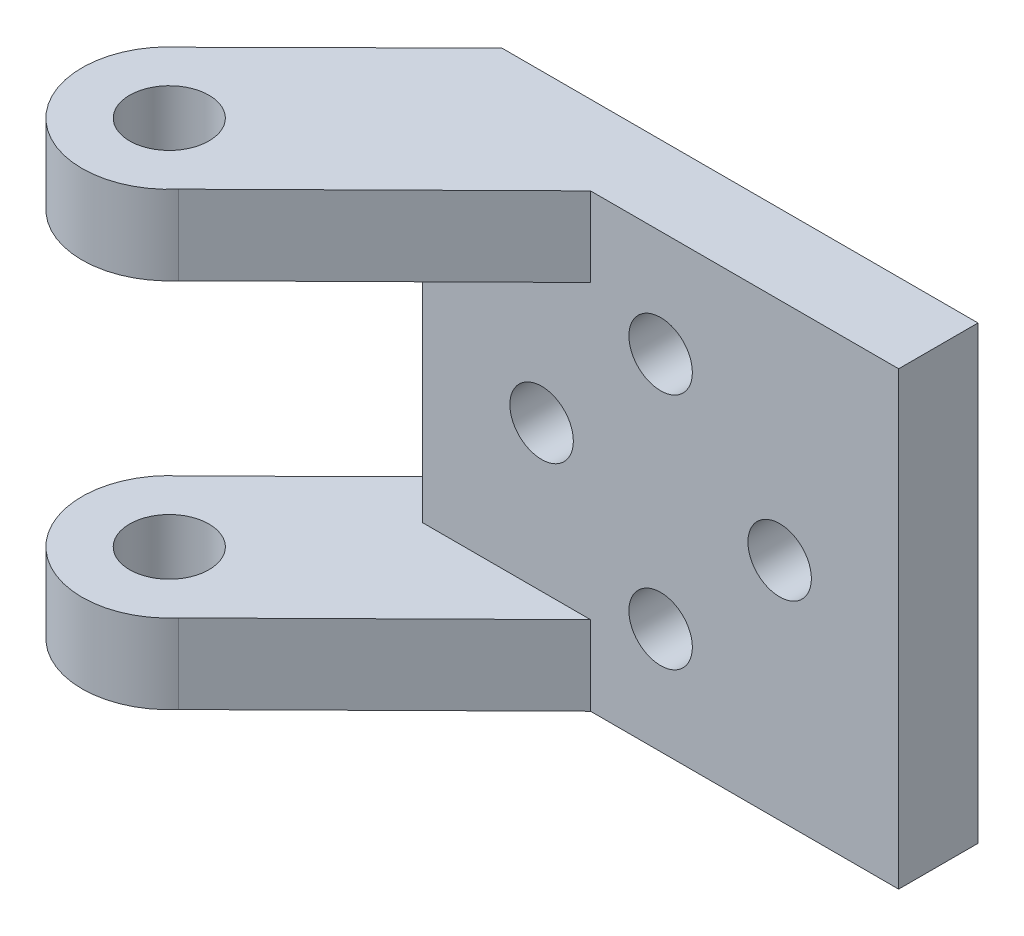
ISO-10303-21;
HEADER;
FILE_DESCRIPTION(('STEP AP214'),'2;1');
FILE_NAME('part.step','',(''),(''),'','','');
FILE_SCHEMA(('AUTOMOTIVE_DESIGN { 1 0 10303 214 1 1 1 1 }'));
ENDSEC;
DATA;
#1=APPLICATION_CONTEXT('core data for automotive mechanical design processes');
#2=APPLICATION_PROTOCOL_DEFINITION('international standard','automotive_design',2000,#1);
#3=PRODUCT_CONTEXT('',#1,'mechanical');
#4=PRODUCT('Part','Part','',(#3));
#5=PRODUCT_RELATED_PRODUCT_CATEGORY('part','',(#4));
#6=PRODUCT_DEFINITION_FORMATION('','',#4);
#7=PRODUCT_DEFINITION_CONTEXT('part definition',#1,'design');
#8=PRODUCT_DEFINITION('design','',#6,#7);
#9=PRODUCT_DEFINITION_SHAPE('','',#8);
#10=(LENGTH_UNIT() NAMED_UNIT(*) SI_UNIT(.MILLI.,.METRE.));
#11=(NAMED_UNIT(*) PLANE_ANGLE_UNIT() SI_UNIT($,.RADIAN.));
#12=(NAMED_UNIT(*) SI_UNIT($,.STERADIAN.) SOLID_ANGLE_UNIT());
#13=UNCERTAINTY_MEASURE_WITH_UNIT(LENGTH_MEASURE(1.E-05),#10,'distance_accuracy_value','');
#14=(GEOMETRIC_REPRESENTATION_CONTEXT(3) GLOBAL_UNCERTAINTY_ASSIGNED_CONTEXT((#13)) GLOBAL_UNIT_ASSIGNED_CONTEXT((#10,
#11,#12)) REPRESENTATION_CONTEXT('',''));
#15=CARTESIAN_POINT('',(0.,0.,0.));
#16=DIRECTION('',(0.,0.,1.));
#17=DIRECTION('',(1.,0.,0.));
#18=AXIS2_PLACEMENT_3D('',#15,#16,#17);
#19=CARTESIAN_POINT('',(6.66142653260565,0.,-42.6789738519283));
#20=DIRECTION('',(-1.,0.,0.));
#21=DIRECTION('',(0.,-1.,0.));
#22=AXIS2_PLACEMENT_3D('',#19,#20,#21);
#23=PLANE('',#22);
#24=DIRECTION('',(0.,-1.,0.));
#25=VECTOR('',#24,1.);
#26=CARTESIAN_POINT('',(6.66142653260565,0.,-6.3));
#27=LINE('',#26,#25);
#28=CARTESIAN_POINT('',(6.66142653260564,18.4,-6.3));
#29=VERTEX_POINT('',#28);
#30=CARTESIAN_POINT('',(6.66142653260565,0.,-6.3));
#31=VERTEX_POINT('',#30);
#32=EDGE_CURVE('E47',#29,#31,#27,.T.);
#33=ORIENTED_EDGE('',*,*,#32,.F.);
#34=DIRECTION('',(0.,0.,-1.));
#35=VECTOR('',#34,1.);
#36=CARTESIAN_POINT('',(6.66142653260564,18.4,-6.3));
#37=LINE('',#36,#35);
#38=CARTESIAN_POINT('',(6.66142653260564,18.4,-11.3));
#39=VERTEX_POINT('',#38);
#40=EDGE_CURVE('E159',#29,#39,#37,.T.);
#41=ORIENTED_EDGE('',*,*,#40,.T.);
#42=DIRECTION('',(0.,-1.,0.));
#43=VECTOR('',#42,1.);
#44=CARTESIAN_POINT('',(6.66142653260565,0.,-11.3));
#45=LINE('',#44,#43);
#46=CARTESIAN_POINT('',(6.66142653260565,0.,-11.3));
#47=VERTEX_POINT('',#46);
#48=EDGE_CURVE('E214',#39,#47,#45,.T.);
#49=ORIENTED_EDGE('',*,*,#48,.T.);
#50=DIRECTION('',(0.,0.,-1.));
#51=VECTOR('',#50,1.);
#52=CARTESIAN_POINT('',(6.66142653260565,0.,0.));
#53=LINE('',#52,#51);
#54=EDGE_CURVE('E179',#31,#47,#53,.T.);
#55=ORIENTED_EDGE('',*,*,#54,.F.);
#56=EDGE_LOOP('',(#33,#41,#49,#55));
#57=FACE_BOUND('',#56,.T.);
#58=ADVANCED_FACE('F43',(#57),#23,.T.);
#59=CARTESIAN_POINT('',(0.,0.,-6.3));
#60=DIRECTION('',(0.,0.,-1.));
#61=DIRECTION('',(-1.,0.,0.));
#62=AXIS2_PLACEMENT_3D('',#59,#60,#61);
#63=PLANE('',#62);
#64=CARTESIAN_POINT('',(21.6614265326056,1.7,-6.3));
#65=DIRECTION('',(0.,0.,1.));
#66=DIRECTION('',(1.,0.,0.));
#67=AXIS2_PLACEMENT_3D('',#64,#65,#66);
#68=CIRCLE('',#67,2.);
#69=CARTESIAN_POINT('',(23.6614265326056,1.7,-6.3));
#70=VERTEX_POINT('',#69);
#71=EDGE_CURVE('E309',#70,#70,#68,.T.);
#72=ORIENTED_EDGE('',*,*,#71,.F.);
#73=EDGE_LOOP('',(#72));
#74=FACE_BOUND('',#73,.T.);
#75=CARTESIAN_POINT('',(21.6614265326057,16.7,-6.3));
#76=DIRECTION('',(0.,0.,1.));
#77=DIRECTION('',(1.,0.,0.));
#78=AXIS2_PLACEMENT_3D('',#75,#76,#77);
#79=CIRCLE('',#78,2.);
#80=CARTESIAN_POINT('',(23.6614265326057,16.7,-6.3));
#81=VERTEX_POINT('',#80);
#82=EDGE_CURVE('E312',#81,#81,#79,.T.);
#83=ORIENTED_EDGE('',*,*,#82,.F.);
#84=EDGE_LOOP('',(#83));
#85=FACE_BOUND('',#84,.T.);
#86=CARTESIAN_POINT('',(29.1614265326057,9.19999999999994,-6.3));
#87=DIRECTION('',(0.,0.,1.));
#88=DIRECTION('',(1.,0.,0.));
#89=AXIS2_PLACEMENT_3D('',#86,#87,#88);
#90=CIRCLE('',#89,2.00000000000001);
#91=CARTESIAN_POINT('',(31.1614265326057,9.19999999999994,-6.3));
#92=VERTEX_POINT('',#91);
#93=EDGE_CURVE('E318',#92,#92,#90,.T.);
#94=ORIENTED_EDGE('',*,*,#93,.F.);
#95=EDGE_LOOP('',(#94));
#96=FACE_BOUND('',#95,.T.);
#97=CARTESIAN_POINT('',(14.1614265326056,9.2,-6.3));
#98=DIRECTION('',(0.,0.,1.));
#99=DIRECTION('',(1.,0.,0.));
#100=AXIS2_PLACEMENT_3D('',#97,#98,#99);
#101=CIRCLE('',#100,2.);
#102=CARTESIAN_POINT('',(16.1614265326056,9.2,-6.3));
#103=VERTEX_POINT('',#102);
#104=EDGE_CURVE('E298',#103,#103,#101,.T.);
#105=ORIENTED_EDGE('',*,*,#104,.F.);
#106=EDGE_LOOP('',(#105));
#107=FACE_BOUND('',#106,.T.);
#108=DIRECTION('',(1.,0.,0.));
#109=VECTOR('',#108,1.);
#110=CARTESIAN_POINT('',(0.,23.4,-6.3));
#111=LINE('',#110,#109);
#112=CARTESIAN_POINT('',(17.2448002027956,23.4,-6.3));
#113=VERTEX_POINT('',#112);
#114=CARTESIAN_POINT('',(36.6614265326056,23.4,-6.3));
#115=VERTEX_POINT('',#114);
#116=EDGE_CURVE('E208',#113,#115,#111,.T.);
#117=ORIENTED_EDGE('',*,*,#116,.F.);
#118=DIRECTION('',(0.,1.,0.));
#119=VECTOR('',#118,1.);
#120=CARTESIAN_POINT('',(17.2448002027956,18.4,-6.3));
#121=LINE('',#120,#119);
#122=CARTESIAN_POINT('',(17.2448002027956,18.4,-6.3));
#123=VERTEX_POINT('',#122);
#124=EDGE_CURVE('E136',#123,#113,#121,.T.);
#125=ORIENTED_EDGE('',*,*,#124,.F.);
#126=DIRECTION('',(-1.,0.,0.));
#127=VECTOR('',#126,1.);
#128=CARTESIAN_POINT('',(17.2448002027956,18.4,-6.3));
#129=LINE('',#128,#127);
#130=EDGE_CURVE('E146',#123,#29,#129,.T.);
#131=ORIENTED_EDGE('',*,*,#130,.T.);
#132=ORIENTED_EDGE('',*,*,#32,.T.);
#133=DIRECTION('',(-1.,0.,0.));
#134=VECTOR('',#133,1.);
#135=CARTESIAN_POINT('',(0.,0.,-6.3));
#136=LINE('',#135,#134);
#137=CARTESIAN_POINT('',(17.2448002027956,0.,-6.3));
#138=VERTEX_POINT('',#137);
#139=EDGE_CURVE('E68',#138,#31,#136,.T.);
#140=ORIENTED_EDGE('',*,*,#139,.F.);
#141=DIRECTION('',(0.,-1.,0.));
#142=VECTOR('',#141,1.);
#143=CARTESIAN_POINT('',(17.2448002027956,0.,-6.3));
#144=LINE('',#143,#142);
#145=CARTESIAN_POINT('',(17.2448002027956,-5.,-6.3));
#146=VERTEX_POINT('',#145);
#147=EDGE_CURVE('E197',#138,#146,#144,.T.);
#148=ORIENTED_EDGE('',*,*,#147,.T.);
#149=DIRECTION('',(1.,0.,0.));
#150=VECTOR('',#149,1.);
#151=CARTESIAN_POINT('',(0.,-5.,-6.3));
#152=LINE('',#151,#150);
#153=CARTESIAN_POINT('',(36.6614265326056,-5.,-6.3));
#154=VERTEX_POINT('',#153);
#155=EDGE_CURVE('E217',#146,#154,#152,.T.);
#156=ORIENTED_EDGE('',*,*,#155,.T.);
#157=DIRECTION('',(0.,-1.,0.));
#158=VECTOR('',#157,1.);
#159=CARTESIAN_POINT('',(36.6614265326056,0.,-6.3));
#160=LINE('',#159,#158);
#161=EDGE_CURVE('E11',#115,#154,#160,.T.);
#162=ORIENTED_EDGE('',*,*,#161,.F.);
#163=EDGE_LOOP('',(#117,#125,#131,#132,#140,#148,#156,#162));
#164=FACE_BOUND('',#163,.T.);
#165=ADVANCED_FACE('F227',(#74,#85,#96,#107,#164),#63,.F.);
#166=CARTESIAN_POINT('',(0.,0.,-11.3));
#167=DIRECTION('',(0.,0.,-1.));
#168=DIRECTION('',(-1.,0.,0.));
#169=AXIS2_PLACEMENT_3D('',#166,#167,#168);
#170=PLANE('',#169);
#171=CARTESIAN_POINT('',(21.6614265326056,1.7,-11.3));
#172=DIRECTION('',(0.,0.,1.));
#173=DIRECTION('',(1.,0.,0.));
#174=AXIS2_PLACEMENT_3D('',#171,#172,#173);
#175=CIRCLE('',#174,2.);
#176=CARTESIAN_POINT('',(23.6614265326056,1.7,-11.3));
#177=VERTEX_POINT('',#176);
#178=EDGE_CURVE('E285',#177,#177,#175,.T.);
#179=ORIENTED_EDGE('',*,*,#178,.T.);
#180=EDGE_LOOP('',(#179));
#181=FACE_BOUND('',#180,.T.);
#182=CARTESIAN_POINT('',(21.6614265326057,16.7,-11.3));
#183=DIRECTION('',(0.,0.,1.));
#184=DIRECTION('',(1.,0.,0.));
#185=AXIS2_PLACEMENT_3D('',#182,#183,#184);
#186=CIRCLE('',#185,2.);
#187=CARTESIAN_POINT('',(23.6614265326057,16.7,-11.3));
#188=VERTEX_POINT('',#187);
#189=EDGE_CURVE('E289',#188,#188,#186,.T.);
#190=ORIENTED_EDGE('',*,*,#189,.T.);
#191=EDGE_LOOP('',(#190));
#192=FACE_BOUND('',#191,.T.);
#193=CARTESIAN_POINT('',(29.1614265326057,9.19999999999994,-11.3));
#194=DIRECTION('',(0.,0.,1.));
#195=DIRECTION('',(1.,0.,0.));
#196=AXIS2_PLACEMENT_3D('',#193,#194,#195);
#197=CIRCLE('',#196,2.00000000000001);
#198=CARTESIAN_POINT('',(31.1614265326057,9.19999999999994,-11.3));
#199=VERTEX_POINT('',#198);
#200=EDGE_CURVE('E293',#199,#199,#197,.T.);
#201=ORIENTED_EDGE('',*,*,#200,.T.);
#202=EDGE_LOOP('',(#201));
#203=FACE_BOUND('',#202,.T.);
#204=CARTESIAN_POINT('',(14.1614265326056,9.2,-11.3));
#205=DIRECTION('',(0.,0.,1.));
#206=DIRECTION('',(1.,0.,0.));
#207=AXIS2_PLACEMENT_3D('',#204,#205,#206);
#208=CIRCLE('',#207,2.);
#209=CARTESIAN_POINT('',(16.1614265326056,9.2,-11.3));
#210=VERTEX_POINT('',#209);
#211=EDGE_CURVE('E296',#210,#210,#208,.T.);
#212=ORIENTED_EDGE('',*,*,#211,.T.);
#213=EDGE_LOOP('',(#212));
#214=FACE_BOUND('',#213,.T.);
#215=CARTESIAN_POINT('',(6.66142653260564,23.4,-11.3));
#216=VERTEX_POINT('',#215);
#217=EDGE_CURVE('E215',#216,#39,#45,.T.);
#218=ORIENTED_EDGE('',*,*,#217,.F.);
#219=DIRECTION('',(1.,0.,0.));
#220=VECTOR('',#219,1.);
#221=CARTESIAN_POINT('',(-1.13542922024918,23.4,-11.3));
#222=LINE('',#221,#220);
#223=CARTESIAN_POINT('',(36.6614265326056,23.4,-11.3));
#224=VERTEX_POINT('',#223);
#225=EDGE_CURVE('E206',#216,#224,#222,.T.);
#226=ORIENTED_EDGE('',*,*,#225,.T.);
#227=DIRECTION('',(0.,-1.,0.));
#228=VECTOR('',#227,1.);
#229=CARTESIAN_POINT('',(36.6614265326056,0.,-11.3));
#230=LINE('',#229,#228);
#231=CARTESIAN_POINT('',(36.6614265326056,-5.,-11.3));
#232=VERTEX_POINT('',#231);
#233=EDGE_CURVE('E52',#224,#232,#230,.T.);
#234=ORIENTED_EDGE('',*,*,#233,.T.);
#235=DIRECTION('',(-1.,0.,0.));
#236=VECTOR('',#235,1.);
#237=CARTESIAN_POINT('',(36.6614265326056,-5.,-11.3));
#238=LINE('',#237,#236);
#239=CARTESIAN_POINT('',(6.66142653260565,-5.,-11.3));
#240=VERTEX_POINT('',#239);
#241=EDGE_CURVE('E199',#232,#240,#238,.T.);
#242=ORIENTED_EDGE('',*,*,#241,.T.);
#243=DIRECTION('',(0.,-1.,0.));
#244=VECTOR('',#243,1.);
#245=CARTESIAN_POINT('',(6.66142653260565,0.,-11.3));
#246=LINE('',#245,#244);
#247=EDGE_CURVE('E200',#47,#240,#246,.T.);
#248=ORIENTED_EDGE('',*,*,#247,.F.);
#249=ORIENTED_EDGE('',*,*,#48,.F.);
#250=EDGE_LOOP('',(#218,#226,#234,#242,#248,#249));
#251=FACE_BOUND('',#250,.T.);
#252=ADVANCED_FACE('F254',(#181,#192,#203,#214,#251),#170,.T.);
#253=CARTESIAN_POINT('',(0.,-5.,0.));
#254=DIRECTION('',(0.,-1.,0.));
#255=DIRECTION('',(0.,0.,-1.));
#256=AXIS2_PLACEMENT_3D('',#253,#254,#255);
#257=PLANE('',#256);
#258=ORIENTED_EDGE('',*,*,#155,.F.);
#259=DIRECTION('',(-0.712249487664979,0.,0.701926397367256));
#260=VECTOR('',#259,1.);
#261=CARTESIAN_POINT('',(5.34686025124313,-5.,5.42549544916405));
#262=LINE('',#261,#260);
#263=CARTESIAN_POINT('',(4.17524525663102,-5.,6.58012947349397));
#264=VERTEX_POINT('',#263);
#265=EDGE_CURVE('E168',#146,#264,#262,.T.);
#266=ORIENTED_EDGE('',*,*,#265,.T.);
#267=CARTESIAN_POINT('',(0.,-5.,3.));
#268=DIRECTION('',(0.,-1.,0.));
#269=DIRECTION('',(0.,0.,-1.));
#270=AXIS2_PLACEMENT_3D('',#267,#268,#269);
#271=CIRCLE('',#270,5.5);
#272=CARTESIAN_POINT('',(-3.46060876661427,-5.,-1.27483180539685));
#273=VERTEX_POINT('',#272);
#274=EDGE_CURVE('E189',#264,#273,#271,.T.);
#275=ORIENTED_EDGE('',*,*,#274,.T.);
#276=DIRECTION('',(-0.710498315696262,0.,0.703698901088225));
#277=VECTOR('',#276,1.);
#278=CARTESIAN_POINT('',(-2.35105270624509,-5.,-2.37376949902448));
#279=LINE('',#278,#277);
#280=EDGE_CURVE('E192',#240,#273,#279,.T.);
#281=ORIENTED_EDGE('',*,*,#280,.F.);
#282=ORIENTED_EDGE('',*,*,#241,.F.);
#283=DIRECTION('',(0.,0.,1.));
#284=VECTOR('',#283,1.);
#285=CARTESIAN_POINT('',(36.6614265326056,-5.,0.));
#286=LINE('',#285,#284);
#287=EDGE_CURVE('E219',#232,#154,#286,.T.);
#288=ORIENTED_EDGE('',*,*,#287,.T.);
#289=EDGE_LOOP('',(#258,#266,#275,#281,#282,#288));
#290=FACE_BOUND('',#289,.T.);
#291=CARTESIAN_POINT('',(0.,-5.,3.));
#292=DIRECTION('',(0.,-1.,0.));
#293=DIRECTION('',(0.,0.,-1.));
#294=AXIS2_PLACEMENT_3D('',#291,#292,#293);
#295=CIRCLE('',#294,2.5);
#296=CARTESIAN_POINT('',(0.,-5.,0.499999999999999));
#297=VERTEX_POINT('',#296);
#298=EDGE_CURVE('E174',#297,#297,#295,.T.);
#299=ORIENTED_EDGE('',*,*,#298,.F.);
#300=EDGE_LOOP('',(#299));
#301=FACE_BOUND('',#300,.T.);
#302=ADVANCED_FACE('F45',(#290,#301),#257,.T.);
#303=CARTESIAN_POINT('',(36.6614265326056,0.,0.));
#304=DIRECTION('',(1.,0.,0.));
#305=DIRECTION('',(0.,0.,-1.));
#306=AXIS2_PLACEMENT_3D('',#303,#304,#305);
#307=PLANE('',#306);
#308=ORIENTED_EDGE('',*,*,#233,.F.);
#309=DIRECTION('',(0.,0.,1.));
#310=VECTOR('',#309,1.);
#311=CARTESIAN_POINT('',(36.6614265326056,23.4,0.));
#312=LINE('',#311,#310);
#313=EDGE_CURVE('E211',#224,#115,#312,.T.);
#314=ORIENTED_EDGE('',*,*,#313,.T.);
#315=ORIENTED_EDGE('',*,*,#161,.T.);
#316=ORIENTED_EDGE('',*,*,#287,.F.);
#317=EDGE_LOOP('',(#308,#314,#315,#316));
#318=FACE_BOUND('',#317,.T.);
#319=ADVANCED_FACE('F248',(#318),#307,.T.);
#320=CARTESIAN_POINT('',(0.,23.4,0.));
#321=DIRECTION('',(0.,1.,0.));
#322=DIRECTION('',(0.,0.,-1.));
#323=AXIS2_PLACEMENT_3D('',#320,#321,#322);
#324=PLANE('',#323);
#325=ORIENTED_EDGE('',*,*,#225,.F.);
#326=DIRECTION('',(-0.710498315696262,0.,0.703698901088225));
#327=VECTOR('',#326,1.);
#328=CARTESIAN_POINT('',(6.66142653260564,23.4,-11.3));
#329=LINE('',#328,#327);
#330=CARTESIAN_POINT('',(-3.46060876661428,23.4,-1.27483180539685));
#331=VERTEX_POINT('',#330);
#332=EDGE_CURVE('E150',#216,#331,#329,.T.);
#333=ORIENTED_EDGE('',*,*,#332,.T.);
#334=CARTESIAN_POINT('',(0.,23.4,3.));
#335=DIRECTION('',(0.,1.,0.));
#336=DIRECTION('',(-1.,0.,0.));
#337=AXIS2_PLACEMENT_3D('',#334,#335,#336);
#338=CIRCLE('',#337,5.5);
#339=CARTESIAN_POINT('',(4.17524525663101,23.4,6.58012947349397));
#340=VERTEX_POINT('',#339);
#341=EDGE_CURVE('E163',#331,#340,#338,.T.);
#342=ORIENTED_EDGE('',*,*,#341,.T.);
#343=DIRECTION('',(0.712249487664979,0.,-0.701926397367256));
#344=VECTOR('',#343,1.);
#345=CARTESIAN_POINT('',(4.17524525663101,23.4,6.58012947349397));
#346=LINE('',#345,#344);
#347=EDGE_CURVE('E60',#340,#113,#346,.T.);
#348=ORIENTED_EDGE('',*,*,#347,.T.);
#349=ORIENTED_EDGE('',*,*,#116,.T.);
#350=ORIENTED_EDGE('',*,*,#313,.F.);
#351=EDGE_LOOP('',(#325,#333,#342,#348,#349,#350));
#352=FACE_BOUND('',#351,.T.);
#353=CARTESIAN_POINT('',(0.,23.4,3.));
#354=DIRECTION('',(0.,1.,0.));
#355=DIRECTION('',(-1.,0.,0.));
#356=AXIS2_PLACEMENT_3D('',#353,#354,#355);
#357=CIRCLE('',#356,2.5);
#358=CARTESIAN_POINT('',(-2.50000000000001,23.4,3.));
#359=VERTEX_POINT('',#358);
#360=EDGE_CURVE('E155',#359,#359,#357,.T.);
#361=ORIENTED_EDGE('',*,*,#360,.F.);
#362=EDGE_LOOP('',(#361));
#363=FACE_BOUND('',#362,.T.);
#364=ADVANCED_FACE('F251',(#352,#363),#324,.T.);
#365=CARTESIAN_POINT('',(5.34686025124313,0.,5.42549544916405));
#366=DIRECTION('',(0.701926397367256,0.,0.712249487664979));
#367=DIRECTION('',(0.712249487664979,0.,-0.701926397367256));
#368=AXIS2_PLACEMENT_3D('',#365,#366,#367);
#369=PLANE('',#368);
#370=ORIENTED_EDGE('',*,*,#265,.F.);
#371=ORIENTED_EDGE('',*,*,#147,.F.);
#372=DIRECTION('',(-0.712249487664979,0.,0.701926397367256));
#373=VECTOR('',#372,1.);
#374=CARTESIAN_POINT('',(5.34686025124313,0.,5.42549544916405));
#375=LINE('',#374,#373);
#376=CARTESIAN_POINT('',(4.17524525663102,0.,6.58012947349397));
#377=VERTEX_POINT('',#376);
#378=EDGE_CURVE('E170',#138,#377,#375,.T.);
#379=ORIENTED_EDGE('',*,*,#378,.T.);
#380=DIRECTION('',(0.,-1.,0.));
#381=VECTOR('',#380,1.);
#382=CARTESIAN_POINT('',(4.17524525663102,0.,6.58012947349397));
#383=LINE('',#382,#381);
#384=EDGE_CURVE('E186',#377,#264,#383,.T.);
#385=ORIENTED_EDGE('',*,*,#384,.T.);
#386=EDGE_LOOP('',(#370,#371,#379,#385));
#387=FACE_BOUND('',#386,.T.);
#388=ADVANCED_FACE('F239',(#387),#369,.T.);
#389=CARTESIAN_POINT('',(-2.35105270624509,0.,-2.37376949902448));
#390=DIRECTION('',(0.703698901088225,0.,0.710498315696262));
#391=DIRECTION('',(0.710498315696262,0.,-0.703698901088225));
#392=AXIS2_PLACEMENT_3D('',#389,#390,#391);
#393=PLANE('',#392);
#394=ORIENTED_EDGE('',*,*,#280,.T.);
#395=DIRECTION('',(0.,-1.,0.));
#396=VECTOR('',#395,1.);
#397=CARTESIAN_POINT('',(-3.46060876661427,0.,-1.27483180539685));
#398=LINE('',#397,#396);
#399=CARTESIAN_POINT('',(-3.46060876661427,0.,-1.27483180539685));
#400=VERTEX_POINT('',#399);
#401=EDGE_CURVE('E203',#400,#273,#398,.T.);
#402=ORIENTED_EDGE('',*,*,#401,.F.);
#403=DIRECTION('',(-0.710498315696262,0.,0.703698901088225));
#404=VECTOR('',#403,1.);
#405=CARTESIAN_POINT('',(-2.35105270624509,0.,-2.37376949902448));
#406=LINE('',#405,#404);
#407=EDGE_CURVE('E177',#47,#400,#406,.T.);
#408=ORIENTED_EDGE('',*,*,#407,.F.);
#409=ORIENTED_EDGE('',*,*,#247,.T.);
#410=EDGE_LOOP('',(#394,#402,#408,#409));
#411=FACE_BOUND('',#410,.T.);
#412=ADVANCED_FACE('F457',(#411),#393,.F.);
#413=CARTESIAN_POINT('',(0.,0.,3.));
#414=DIRECTION('',(0.,-1.,0.));
#415=DIRECTION('',(0.,0.,-1.));
#416=AXIS2_PLACEMENT_3D('',#413,#414,#415);
#417=CYLINDRICAL_SURFACE('',#416,5.5);
#418=ORIENTED_EDGE('',*,*,#274,.F.);
#419=ORIENTED_EDGE('',*,*,#384,.F.);
#420=CARTESIAN_POINT('',(0.,0.,3.));
#421=DIRECTION('',(0.,-1.,0.));
#422=DIRECTION('',(0.,0.,-1.));
#423=AXIS2_PLACEMENT_3D('',#420,#421,#422);
#424=CIRCLE('',#423,5.5);
#425=EDGE_CURVE('E173',#377,#400,#424,.T.);
#426=ORIENTED_EDGE('',*,*,#425,.T.);
#427=ORIENTED_EDGE('',*,*,#401,.T.);
#428=EDGE_LOOP('',(#418,#419,#426,#427));
#429=FACE_BOUND('',#428,.T.);
#430=ADVANCED_FACE('F447',(#429),#417,.T.);
#431=CARTESIAN_POINT('',(0.,0.,3.));
#432=DIRECTION('',(0.,-1.,0.));
#433=DIRECTION('',(0.,0.,-1.));
#434=AXIS2_PLACEMENT_3D('',#431,#432,#433);
#435=CYLINDRICAL_SURFACE('',#434,2.5);
#436=CARTESIAN_POINT('',(0.,0.,3.));
#437=DIRECTION('',(0.,-1.,0.));
#438=DIRECTION('',(0.,0.,-1.));
#439=AXIS2_PLACEMENT_3D('',#436,#437,#438);
#440=CIRCLE('',#439,2.5);
#441=CARTESIAN_POINT('',(0.,0.,0.499999999999999));
#442=VERTEX_POINT('',#441);
#443=EDGE_CURVE('E183',#442,#442,#440,.T.);
#444=ORIENTED_EDGE('',*,*,#443,.F.);
#445=EDGE_LOOP('',(#444));
#446=FACE_BOUND('',#445,.T.);
#447=ORIENTED_EDGE('',*,*,#298,.T.);
#448=EDGE_LOOP('',(#447));
#449=FACE_BOUND('',#448,.T.);
#450=ADVANCED_FACE('F439',(#446,#449),#435,.F.);
#451=CARTESIAN_POINT('',(0.,0.,0.));
#452=DIRECTION('',(0.,-1.,0.));
#453=DIRECTION('',(0.,0.,-1.));
#454=AXIS2_PLACEMENT_3D('',#451,#452,#453);
#455=PLANE('',#454);
#456=ORIENTED_EDGE('',*,*,#378,.F.);
#457=ORIENTED_EDGE('',*,*,#139,.T.);
#458=ORIENTED_EDGE('',*,*,#54,.T.);
#459=ORIENTED_EDGE('',*,*,#407,.T.);
#460=ORIENTED_EDGE('',*,*,#425,.F.);
#461=EDGE_LOOP('',(#456,#457,#458,#459,#460));
#462=FACE_BOUND('',#461,.T.);
#463=ORIENTED_EDGE('',*,*,#443,.T.);
#464=EDGE_LOOP('',(#463));
#465=FACE_BOUND('',#464,.T.);
#466=ADVANCED_FACE('F234',(#462,#465),#455,.F.);
#467=CARTESIAN_POINT('',(0.,18.4,3.));
#468=DIRECTION('',(0.,1.,0.));
#469=DIRECTION('',(-1.,0.,0.));
#470=AXIS2_PLACEMENT_3D('',#467,#468,#469);
#471=CYLINDRICAL_SURFACE('',#470,5.5);
#472=ORIENTED_EDGE('',*,*,#341,.F.);
#473=DIRECTION('',(0.,1.,0.));
#474=VECTOR('',#473,1.);
#475=CARTESIAN_POINT('',(-3.46060876661427,18.4,-1.27483180539685));
#476=LINE('',#475,#474);
#477=CARTESIAN_POINT('',(-3.46060876661427,18.4,-1.27483180539685));
#478=VERTEX_POINT('',#477);
#479=EDGE_CURVE('E149',#478,#331,#476,.T.);
#480=ORIENTED_EDGE('',*,*,#479,.F.);
#481=CARTESIAN_POINT('',(0.,18.4,3.));
#482=DIRECTION('',(0.,1.,0.));
#483=DIRECTION('',(-1.,0.,0.));
#484=AXIS2_PLACEMENT_3D('',#481,#482,#483);
#485=CIRCLE('',#484,5.5);
#486=CARTESIAN_POINT('',(4.17524525663101,18.4,6.58012947349397));
#487=VERTEX_POINT('',#486);
#488=EDGE_CURVE('E143',#478,#487,#485,.T.);
#489=ORIENTED_EDGE('',*,*,#488,.T.);
#490=DIRECTION('',(0.,1.,0.));
#491=VECTOR('',#490,1.);
#492=CARTESIAN_POINT('',(4.17524525663101,18.4,6.58012947349397));
#493=LINE('',#492,#491);
#494=EDGE_CURVE('E128',#487,#340,#493,.T.);
#495=ORIENTED_EDGE('',*,*,#494,.T.);
#496=EDGE_LOOP('',(#472,#480,#489,#495));
#497=FACE_BOUND('',#496,.T.);
#498=ADVANCED_FACE('F148',(#497),#471,.T.);
#499=CARTESIAN_POINT('',(6.66142653260564,18.4,-11.3));
#500=DIRECTION('',(-0.703698901088225,0.,-0.710498315696262));
#501=DIRECTION('',(-0.710498315696262,0.,0.703698901088225));
#502=AXIS2_PLACEMENT_3D('',#499,#500,#501);
#503=PLANE('',#502);
#504=ORIENTED_EDGE('',*,*,#332,.F.);
#505=ORIENTED_EDGE('',*,*,#217,.T.);
#506=DIRECTION('',(-0.710498315696262,0.,0.703698901088225));
#507=VECTOR('',#506,1.);
#508=CARTESIAN_POINT('',(6.66142653260564,18.4,-11.3));
#509=LINE('',#508,#507);
#510=EDGE_CURVE('E137',#39,#478,#509,.T.);
#511=ORIENTED_EDGE('',*,*,#510,.T.);
#512=ORIENTED_EDGE('',*,*,#479,.T.);
#513=EDGE_LOOP('',(#504,#505,#511,#512));
#514=FACE_BOUND('',#513,.T.);
#515=ADVANCED_FACE('F256',(#514),#503,.T.);
#516=CARTESIAN_POINT('',(4.17524525663101,18.4,6.58012947349397));
#517=DIRECTION('',(0.701926397367256,0.,0.712249487664979));
#518=DIRECTION('',(0.712249487664979,0.,-0.701926397367256));
#519=AXIS2_PLACEMENT_3D('',#516,#517,#518);
#520=PLANE('',#519);
#521=ORIENTED_EDGE('',*,*,#347,.F.);
#522=ORIENTED_EDGE('',*,*,#494,.F.);
#523=DIRECTION('',(0.712249487664979,0.,-0.701926397367256));
#524=VECTOR('',#523,1.);
#525=CARTESIAN_POINT('',(4.17524525663101,18.4,6.58012947349397));
#526=LINE('',#525,#524);
#527=EDGE_CURVE('E131',#487,#123,#526,.T.);
#528=ORIENTED_EDGE('',*,*,#527,.T.);
#529=ORIENTED_EDGE('',*,*,#124,.T.);
#530=EDGE_LOOP('',(#521,#522,#528,#529));
#531=FACE_BOUND('',#530,.T.);
#532=ADVANCED_FACE('F130',(#531),#520,.T.);
#533=CARTESIAN_POINT('',(0.,18.4,3.));
#534=DIRECTION('',(0.,1.,0.));
#535=DIRECTION('',(-1.,0.,0.));
#536=AXIS2_PLACEMENT_3D('',#533,#534,#535);
#537=PLANE('',#536);
#538=CARTESIAN_POINT('',(0.,18.4,3.));
#539=DIRECTION('',(0.,1.,0.));
#540=DIRECTION('',(-1.,0.,0.));
#541=AXIS2_PLACEMENT_3D('',#538,#539,#540);
#542=CIRCLE('',#541,2.5);
#543=CARTESIAN_POINT('',(-2.50000000000001,18.4,3.));
#544=VERTEX_POINT('',#543);
#545=EDGE_CURVE('E165',#544,#544,#542,.T.);
#546=ORIENTED_EDGE('',*,*,#545,.T.);
#547=EDGE_LOOP('',(#546));
#548=FACE_BOUND('',#547,.T.);
#549=ORIENTED_EDGE('',*,*,#488,.F.);
#550=ORIENTED_EDGE('',*,*,#510,.F.);
#551=ORIENTED_EDGE('',*,*,#40,.F.);
#552=ORIENTED_EDGE('',*,*,#130,.F.);
#553=ORIENTED_EDGE('',*,*,#527,.F.);
#554=EDGE_LOOP('',(#549,#550,#551,#552,#553));
#555=FACE_BOUND('',#554,.T.);
#556=ADVANCED_FACE('F141',(#548,#555),#537,.F.);
#557=CARTESIAN_POINT('',(0.,18.4,3.));
#558=DIRECTION('',(0.,1.,0.));
#559=DIRECTION('',(-1.,0.,0.));
#560=AXIS2_PLACEMENT_3D('',#557,#558,#559);
#561=CYLINDRICAL_SURFACE('',#560,2.5);
#562=ORIENTED_EDGE('',*,*,#545,.F.);
#563=EDGE_LOOP('',(#562));
#564=FACE_BOUND('',#563,.T.);
#565=ORIENTED_EDGE('',*,*,#360,.T.);
#566=EDGE_LOOP('',(#565));
#567=FACE_BOUND('',#566,.T.);
#568=ADVANCED_FACE('F329',(#564,#567),#561,.F.);
#569=CARTESIAN_POINT('',(14.1614265326056,9.2,-11.3));
#570=DIRECTION('',(0.,0.,1.));
#571=DIRECTION('',(1.,0.,0.));
#572=AXIS2_PLACEMENT_3D('',#569,#570,#571);
#573=CYLINDRICAL_SURFACE('',#572,2.);
#574=ORIENTED_EDGE('',*,*,#211,.F.);
#575=EDGE_LOOP('',(#574));
#576=FACE_BOUND('',#575,.T.);
#577=ORIENTED_EDGE('',*,*,#104,.T.);
#578=EDGE_LOOP('',(#577));
#579=FACE_BOUND('',#578,.T.);
#580=ADVANCED_FACE('F327',(#576,#579),#573,.F.);
#581=CARTESIAN_POINT('',(29.1614265326057,9.19999999999994,-11.3));
#582=DIRECTION('',(0.,0.,1.));
#583=DIRECTION('',(1.,0.,0.));
#584=AXIS2_PLACEMENT_3D('',#581,#582,#583);
#585=CYLINDRICAL_SURFACE('',#584,2.00000000000001);
#586=ORIENTED_EDGE('',*,*,#200,.F.);
#587=EDGE_LOOP('',(#586));
#588=FACE_BOUND('',#587,.T.);
#589=ORIENTED_EDGE('',*,*,#93,.T.);
#590=EDGE_LOOP('',(#589));
#591=FACE_BOUND('',#590,.T.);
#592=ADVANCED_FACE('F322',(#588,#591),#585,.F.);
#593=CARTESIAN_POINT('',(21.6614265326057,16.7,-11.3));
#594=DIRECTION('',(0.,0.,1.));
#595=DIRECTION('',(1.,0.,0.));
#596=AXIS2_PLACEMENT_3D('',#593,#594,#595);
#597=CYLINDRICAL_SURFACE('',#596,2.);
#598=ORIENTED_EDGE('',*,*,#189,.F.);
#599=EDGE_LOOP('',(#598));
#600=FACE_BOUND('',#599,.T.);
#601=ORIENTED_EDGE('',*,*,#82,.T.);
#602=EDGE_LOOP('',(#601));
#603=FACE_BOUND('',#602,.T.);
#604=ADVANCED_FACE('F335',(#600,#603),#597,.F.);
#605=CARTESIAN_POINT('',(21.6614265326056,1.7,-11.3));
#606=DIRECTION('',(0.,0.,1.));
#607=DIRECTION('',(1.,0.,0.));
#608=AXIS2_PLACEMENT_3D('',#605,#606,#607);
#609=CYLINDRICAL_SURFACE('',#608,2.);
#610=ORIENTED_EDGE('',*,*,#178,.F.);
#611=EDGE_LOOP('',(#610));
#612=FACE_BOUND('',#611,.T.);
#613=ORIENTED_EDGE('',*,*,#71,.T.);
#614=EDGE_LOOP('',(#613));
#615=FACE_BOUND('',#614,.T.);
#616=ADVANCED_FACE('F386',(#612,#615),#609,.F.);
#617=CLOSED_SHELL('',(#58,#165,#252,#302,#319,#364,#388,#412,#430,#450,#466,#498,#515,#532,#556,
#568,#580,#592,#604,#616));
#618=MANIFOLD_SOLID_BREP('B2',#617);
#619=ADVANCED_BREP_SHAPE_REPRESENTATION('',(#18,#618),#14);
#620=SHAPE_DEFINITION_REPRESENTATION(#9,#619);
ENDSEC;
END-ISO-10303-21;
